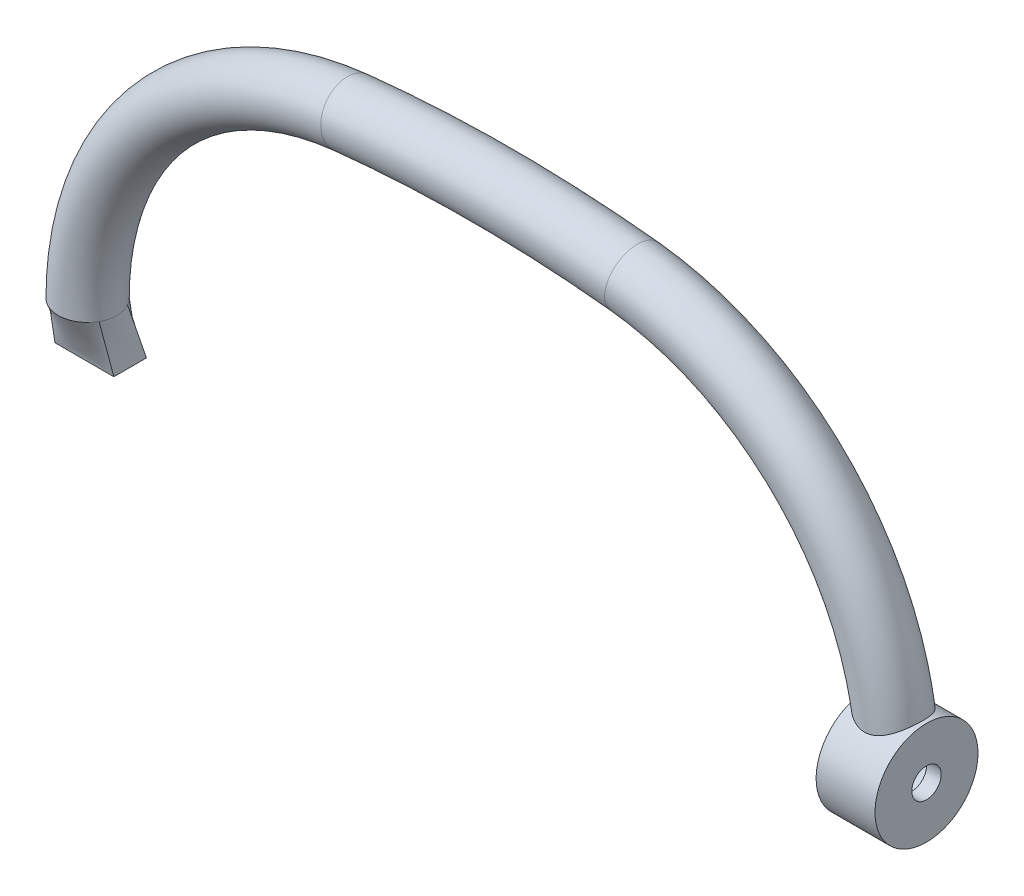
ISO-10303-21;
HEADER;
FILE_DESCRIPTION(('STEP AP214'),'2;1');
FILE_NAME('part.step','',(''),(''),'','','');
FILE_SCHEMA(('AUTOMOTIVE_DESIGN { 1 0 10303 214 1 1 1 1 }'));
ENDSEC;
DATA;
#1=APPLICATION_CONTEXT('core data for automotive mechanical design processes');
#2=APPLICATION_PROTOCOL_DEFINITION('international standard','automotive_design',2000,#1);
#3=PRODUCT_CONTEXT('',#1,'mechanical');
#4=PRODUCT('Part','Part','',(#3));
#5=PRODUCT_RELATED_PRODUCT_CATEGORY('part','',(#4));
#6=PRODUCT_DEFINITION_FORMATION('','',#4);
#7=PRODUCT_DEFINITION_CONTEXT('part definition',#1,'design');
#8=PRODUCT_DEFINITION('design','',#6,#7);
#9=PRODUCT_DEFINITION_SHAPE('','',#8);
#10=(LENGTH_UNIT() NAMED_UNIT(*) SI_UNIT(.MILLI.,.METRE.));
#11=(NAMED_UNIT(*) PLANE_ANGLE_UNIT() SI_UNIT($,.RADIAN.));
#12=(NAMED_UNIT(*) SI_UNIT($,.STERADIAN.) SOLID_ANGLE_UNIT());
#13=UNCERTAINTY_MEASURE_WITH_UNIT(LENGTH_MEASURE(1.E-05),#10,'distance_accuracy_value','');
#14=(GEOMETRIC_REPRESENTATION_CONTEXT(3) GLOBAL_UNCERTAINTY_ASSIGNED_CONTEXT((#13)) GLOBAL_UNIT_ASSIGNED_CONTEXT((#10,
#11,#12)) REPRESENTATION_CONTEXT('',''));
#15=CARTESIAN_POINT('',(0.,0.,0.));
#16=DIRECTION('',(0.,0.,1.));
#17=DIRECTION('',(1.,0.,0.));
#18=AXIS2_PLACEMENT_3D('',#15,#16,#17);
#19=CARTESIAN_POINT('',(0.,0.,0.));
#20=DIRECTION('',(0.,0.,-1.));
#21=DIRECTION('',(-1.,0.,0.));
#22=AXIS2_PLACEMENT_3D('',#19,#20,#21);
#23=TOROIDAL_SURFACE('',#22,20.,2.);
#24=CARTESIAN_POINT('',(2.14285714285713,19.8848727243929,0.));
#25=DIRECTION('',(0.994243636219647,-0.107142857142856,0.));
#26=DIRECTION('',(0.,0.,1.));
#27=AXIS2_PLACEMENT_3D('',#24,#25,#26);
#28=CIRCLE('',#27,2.);
#29=CARTESIAN_POINT('',(2.35714285714285,21.8733599968322,0.));
#30=VERTEX_POINT('',#29);
#31=EDGE_CURVE('E368',#30,#30,#28,.T.);
#32=ORIENTED_EDGE('',*,*,#31,.T.);
#33=EDGE_LOOP('',(#32));
#34=FACE_BOUND('',#33,.T.);
#35=CARTESIAN_POINT('',(18.,0.,0.));
#36=CARTESIAN_POINT('',(18.,0.0084852776977507,-0.0028284187399953));
#37=CARTESIAN_POINT('',(18.,0.0169705591225947,-0.00565684601700149));
#38=CARTESIAN_POINT('',(17.9999999999998,0.658301578533719,-0.219432779855528));
#39=CARTESIAN_POINT('',(18.,1.29120259657415,-0.430319034278899));
#40=CARTESIAN_POINT('',(18.,2.24425640629901,-0.734311765184615));
#41=CARTESIAN_POINT('',(18.,2.56243364505894,-0.833550381746703));
#42=CARTESIAN_POINT('',(18.,3.20074197947092,-1.02574997816264));
#43=CARTESIAN_POINT('',(18.,3.52087333604269,-1.11871009877498));
#44=CARTESIAN_POINT('',(18.,4.1773883543311,-1.29971375438033));
#45=CARTESIAN_POINT('',(18.,4.51387873008351,-1.38737375011006));
#46=CARTESIAN_POINT('',(18.,5.18983128002098,-1.54998941439078));
#47=CARTESIAN_POINT('',(18.,5.52929214699563,-1.62495040212449));
#48=CARTESIAN_POINT('',(18.,6.04168741426811,-1.72514605558347));
#49=CARTESIAN_POINT('',(18.,6.21341730964267,-1.75656150006879));
#50=CARTESIAN_POINT('',(18.,6.55767044922207,-1.814633233064));
#51=CARTESIAN_POINT('',(18.,6.73019362052485,-1.84128995027581));
#52=CARTESIAN_POINT('',(18.,7.07625478611551,-1.88923870648288));
#53=CARTESIAN_POINT('',(18.,7.24979390459324,-1.91052274578261));
#54=CARTESIAN_POINT('',(18.,7.59757211624587,-1.94689640907685));
#55=CARTESIAN_POINT('',(18.,7.77181141715341,-1.96198403273679));
#56=CARTESIAN_POINT('',(18.,7.94631419912595,-1.9735770658888));
#57=B_SPLINE_CURVE_WITH_KNOTS('',3,(#35,#36,#37,#38,#39,#40,#41,#42,#43,#44,#45,#46,#47,#48,#49,
#50,#51,#52,#53,#54,#55,#56),.UNSPECIFIED.,.F.,.F.,(4,2,2,2,2,2,2,2,2,2,4),(0.,
0.026832815730005,2.02806436761708,3.02790306012793,4.02787830912823,5.07087129770871,
6.11342632596965,6.63711099490324,7.16074846255347,7.68516106592174,8.20974282799929),.UNSPECIFIED.);
#58=CARTESIAN_POINT('',(18.,3.33448482715097,-1.06358400585001));
#59=VERTEX_POINT('',#58);
#60=CARTESIAN_POINT('',(18.,2.37684960872581,-0.774974797977307));
#61=VERTEX_POINT('',#60);
#62=EDGE_CURVE('E354',#59,#61,#57,.F.);
#63=ORIENTED_EDGE('',*,*,#62,.T.);
#64=CARTESIAN_POINT('',(21.0002,1.84920408115571,-1.68239242337722));
#65=CARTESIAN_POINT('',(20.9659400207683,1.8281763171251,-1.70550837746359));
#66=CARTESIAN_POINT('',(20.9308341573535,1.80735001728865,-1.72752423418774));
#67=CARTESIAN_POINT('',(20.8588126614154,1.76645354930086,-1.76932121222239));
#68=CARTESIAN_POINT('',(20.8218944917588,1.74638451500908,-1.78909906466791));
#69=CARTESIAN_POINT('',(20.7074262525141,1.68743632729869,-1.84540512722082));
#70=CARTESIAN_POINT('',(20.627037805483,1.65037595329724,-1.87830830087958));
#71=CARTESIAN_POINT('',(20.4752478050657,1.59193461069129,-1.92793427620761));
#72=CARTESIAN_POINT('',(20.4051128714825,1.5689075648736,-1.94655533298262));
#73=CARTESIAN_POINT('',(20.261212563212,1.53193814485359,-1.9757852676492));
#74=CARTESIAN_POINT('',(20.1874708568212,1.51794335391162,-1.98644043209632));
#75=CARTESIAN_POINT('',(20.0373143172989,1.50102796040123,-1.99926056599483));
#76=CARTESIAN_POINT('',(19.9608823022502,1.49820082474848,-2.00135388278599));
#77=CARTESIAN_POINT('',(19.8086353754033,1.50409220955324,-1.99692530932764));
#78=CARTESIAN_POINT('',(19.732822006416,1.5128338686445,-1.9903861534186));
#79=CARTESIAN_POINT('',(19.5674729007258,1.54288109253603,-1.96721604749341));
#80=CARTESIAN_POINT('',(19.4786653313316,1.56656148139488,-1.94865336428687));
#81=CARTESIAN_POINT('',(19.3066828303237,1.62317614426913,-1.90174580669176));
#82=CARTESIAN_POINT('',(19.2235274982601,1.65614076365622,-1.87336878374694));
#83=CARTESIAN_POINT('',(19.0807544410261,1.7193347903655,-1.81529927789146));
#84=CARTESIAN_POINT('',(19.019988848792,1.74856533489378,-1.78727564837799));
#85=CARTESIAN_POINT('',(18.9018279187219,1.80876343224496,-1.72632820661112));
#86=CARTESIAN_POINT('',(18.8444344793306,1.83973194468301,-1.69340167030718));
#87=CARTESIAN_POINT('',(18.7330116274173,1.90229977579267,-1.62280076667258));
#88=CARTESIAN_POINT('',(18.6789822814753,1.93389910693271,-1.58512630541854));
#89=CARTESIAN_POINT('',(18.5743816517581,1.99684721331987,-1.50505708214785));
#90=CARTESIAN_POINT('',(18.5238110609927,2.02819593724961,-1.4626613786107));
#91=CARTESIAN_POINT('',(18.3931590777696,2.11086836372509,-1.34260447029889));
#92=CARTESIAN_POINT('',(18.3164118033667,2.16126923196937,-1.26057655044263));
#93=CARTESIAN_POINT('',(18.1757256556394,2.25547600727885,-1.08300225219527));
#94=CARTESIAN_POINT('',(18.111757922838,2.29929671709744,-0.987487183956426));
#95=CARTESIAN_POINT('',(18.0137271602174,2.36718458732854,-0.808244709684123));
#96=CARTESIAN_POINT('',(17.976174083208,2.3934648639459,-0.727279992327964));
#97=CARTESIAN_POINT('',(17.9124656454321,2.43827195385319,-0.558923472064251));
#98=CARTESIAN_POINT('',(17.8863020860854,2.45680434396562,-0.471536345375159));
#99=CARTESIAN_POINT('',(17.8471376264748,2.48460522315396,-0.291662019522292));
#100=CARTESIAN_POINT('',(17.8342363123815,2.493803616737,-0.199141654786769));
#101=CARTESIAN_POINT('',(17.8231535456483,2.5017030057623,-0.0127866316599169));
#102=CARTESIAN_POINT('',(17.8249647506525,2.50040923737083,0.081047347827014));
#103=CARTESIAN_POINT('',(17.8420562037888,2.48823414733131,0.255915691565243));
#104=CARTESIAN_POINT('',(17.8557772137586,2.47846278346837,0.337189603861867));
#105=CARTESIAN_POINT('',(17.8936149233576,2.451627898906,0.496000573165247));
#106=CARTESIAN_POINT('',(17.9177357483659,2.43456148444278,0.573536133665217));
#107=CARTESIAN_POINT('',(17.9836735803289,2.38819587142494,0.746144905391312));
#108=CARTESIAN_POINT('',(18.0286353085314,2.35675865732979,0.839439275629168));
#109=CARTESIAN_POINT('',(18.1307982085419,2.28627415601607,1.01588993646429));
#110=CARTESIAN_POINT('',(18.1880231443961,2.24721210643044,1.09902604376982));
#111=CARTESIAN_POINT('',(18.3329346806832,2.15024733469275,1.28072103732762));
#112=CARTESIAN_POINT('',(18.4244240801286,2.09039782497562,1.37522135090106));
#113=CARTESIAN_POINT('',(18.5720088789794,1.99836189272847,1.50310557204634));
#114=CARTESIAN_POINT('',(18.6230007561376,1.96726510290094,1.54346528484859));
#115=CARTESIAN_POINT('',(18.728314834291,1.90508621486735,1.61958629148961));
#116=CARTESIAN_POINT('',(18.7826361048173,1.87400411498086,1.65534886152085));
#117=CARTESIAN_POINT('',(18.9289950401211,1.79385072533904,1.74282768972392));
#118=CARTESIAN_POINT('',(19.0236766969994,1.74547623429723,1.79082345777283));
#119=CARTESIAN_POINT('',(19.2218092475537,1.65618874008624,1.87369227111685));
#120=CARTESIAN_POINT('',(19.3252322654951,1.61525323871825,1.90860523560807));
#121=CARTESIAN_POINT('',(19.5026194115017,1.56051593557565,1.95335042977941));
#122=CARTESIAN_POINT('',(19.5740239831555,1.54223985103943,1.96768629973102));
#123=CARTESIAN_POINT('',(19.7195865072396,1.51477420821138,1.98891135508101));
#124=CARTESIAN_POINT('',(19.7937376266186,1.50556348997703,1.99581788520987));
#125=CARTESIAN_POINT('',(19.9435301776995,1.49815275346038,2.00139225379784));
#126=CARTESIAN_POINT('',(20.0191786499759,1.50003686175042,1.99999714419726));
#127=CARTESIAN_POINT('',(20.1687551559612,1.51501303309903,1.98867106720634));
#128=CARTESIAN_POINT('',(20.2426806438174,1.52812071962581,1.97872820107328));
#129=CARTESIAN_POINT('',(20.3998745599466,1.56667278936235,1.94839099788901));
#130=CARTESIAN_POINT('',(20.4823719968076,1.59393797425332,1.92641507589139));
#131=CARTESIAN_POINT('',(20.6408953211212,1.65665420044318,1.87274936566448));
#132=CARTESIAN_POINT('',(20.7169046832208,1.69212533813717,1.84103566615615));
#133=CARTESIAN_POINT('',(20.8264673866117,1.74884794130322,1.78668353737853));
#134=CARTESIAN_POINT('',(20.8625119126297,1.76851044910297,1.7672554836304));
#135=CARTESIAN_POINT('',(20.9327004918064,1.80845658773598,1.7263539443983));
#136=CARTESIAN_POINT('',(20.96685479849,1.82873569698201,1.70489366186803));
#137=CARTESIAN_POINT('',(21.0002,1.84920408115571,1.68239242337722));
#138=B_SPLINE_CURVE_WITH_KNOTS('',3,(#64,#65,#66,#67,#68,#69,#70,#71,#72,#73,#74,#75,#76,#77,
#78,#79,#80,#81,#82,#83,#84,#85,#86,#87,#88,#89,#90,#91,#92,#93,#94,#95,#96,#97,#98,#99,#100,
#101,#102,#103,#104,#105,#106,#107,#108,#109,#110,#111,#112,#113,#114,#115,#116,#117,#118,#119,
#120,#121,#122,#123,#124,#125,#126,#127,#128,#129,#130,#131,#132,#133,#134,#135,#136,#137),
.UNSPECIFIED.,.F.,.F.,(4,2,2,2,2,2,2,2,2,2,2,2,2,2,2,2,2,2,2,2,2,2,2,2,2,2,2,2,2,2,2,2,2,2,2,2,
4),(0.,0.139055779930908,0.278312114450483,0.560394207510414,0.787948799447709,1.01417066227201,
1.24228191159127,1.4708500942327,1.75059457452604,2.03126422357064,2.25006455318216,
2.4689869048072,2.68791358783111,2.90688400814315,3.27485253041132,3.64198045150225,
3.92003401231304,4.19788708796581,4.47781164961812,4.75759652210796,5.00548130727855,
5.25346451351639,5.57636960624353,5.89990618664631,6.33098158319245,6.5470724113636,
6.76310312136872,7.11203670972705,7.45989676548058,7.68439654294631,7.90837105219846,
8.13404602506935,8.36003565413198,8.62744584850291,8.89551799659354,9.03171483794834,
9.16708070539416),.UNSPECIFIED.);
#139=CARTESIAN_POINT('',(18.,2.37684960872581,0.7749747979773));
#140=VERTEX_POINT('',#139);
#141=EDGE_CURVE('E87',#61,#140,#138,.T.);
#142=ORIENTED_EDGE('',*,*,#141,.T.);
#143=CARTESIAN_POINT('',(18.,0.,0.));
#144=CARTESIAN_POINT('',(18.,0.0084852776977507,0.0028284187399953));
#145=CARTESIAN_POINT('',(18.,0.0169705591225947,0.00565684601700149));
#146=CARTESIAN_POINT('',(17.9999999999998,0.658301578533719,0.219432779855528));
#147=CARTESIAN_POINT('',(18.,1.29120259657415,0.430319034278899));
#148=CARTESIAN_POINT('',(18.,2.24425640629901,0.734311765184615));
#149=CARTESIAN_POINT('',(18.,2.56243364505894,0.833550381746703));
#150=CARTESIAN_POINT('',(18.,3.20074197947092,1.02574997816264));
#151=CARTESIAN_POINT('',(18.,3.52087333604269,1.11871009877498));
#152=CARTESIAN_POINT('',(18.,4.1773883543311,1.29971375438033));
#153=CARTESIAN_POINT('',(18.,4.51387873008351,1.38737375011006));
#154=CARTESIAN_POINT('',(18.,5.18983128002098,1.54998941439078));
#155=CARTESIAN_POINT('',(18.,5.52929214699563,1.62495040212449));
#156=CARTESIAN_POINT('',(18.,6.04168741426811,1.72514605558347));
#157=CARTESIAN_POINT('',(18.,6.21341730964267,1.75656150006879));
#158=CARTESIAN_POINT('',(18.,6.55767044922207,1.814633233064));
#159=CARTESIAN_POINT('',(18.,6.73019362052485,1.84128995027581));
#160=CARTESIAN_POINT('',(18.,7.07625478611551,1.88923870648288));
#161=CARTESIAN_POINT('',(18.,7.24979390459324,1.91052274578261));
#162=CARTESIAN_POINT('',(18.,7.59757211624587,1.94689640907685));
#163=CARTESIAN_POINT('',(18.,7.77181141715341,1.96198403273679));
#164=CARTESIAN_POINT('',(18.,7.94631419912595,1.9735770658888));
#165=B_SPLINE_CURVE_WITH_KNOTS('',3,(#143,#144,#145,#146,#147,#148,#149,#150,#151,#152,#153,
#154,#155,#156,#157,#158,#159,#160,#161,#162,#163,#164),.UNSPECIFIED.,.F.,.F.,(4,2,2,2,2,2,2,2,
2,2,4),(0.,0.026832815730005,2.02806436761708,3.02790306012793,4.02787830912823,
5.07087129770871,6.11342632596965,6.63711099490324,7.16074846255347,7.68516106592174,
8.20974282799929),.UNSPECIFIED.);
#166=CARTESIAN_POINT('',(18.,3.33448482715097,1.06358400585003));
#167=VERTEX_POINT('',#166);
#168=EDGE_CURVE('E360',#140,#167,#165,.T.);
#169=ORIENTED_EDGE('',*,*,#168,.T.);
#170=CARTESIAN_POINT('',(17.9998,3.33457626116305,1.06329730484369));
#171=CARTESIAN_POINT('',(18.0363091323096,3.31789105265571,1.11562869203751));
#172=CARTESIAN_POINT('',(18.0751241034328,3.30044875989444,1.16606765998625));
#173=CARTESIAN_POINT('',(18.1569237271834,3.26457839392446,1.26301004206407));
#174=CARTESIAN_POINT('',(18.199905639204,3.24615097216754,1.30951600575166));
#175=CARTESIAN_POINT('',(18.2898456686957,3.20873248983682,1.3987084198935));
#176=CARTESIAN_POINT('',(18.3368206338454,3.18973928545513,1.44137694702646));
#177=CARTESIAN_POINT('',(18.434252147841,3.15180209485896,1.52254830916065));
#178=CARTESIAN_POINT('',(18.4847093696856,3.13285811889683,1.56105033520925));
#179=CARTESIAN_POINT('',(18.6406944885313,3.07698303903905,1.66997303348215));
#180=CARTESIAN_POINT('',(18.751079363279,3.04090298447734,1.73405013932892));
#181=CARTESIAN_POINT('',(18.9826183110037,2.97596252469405,1.84328537038773));
#182=CARTESIAN_POINT('',(19.103747481911,2.94708598742258,1.88848592501745));
#183=CARTESIAN_POINT('',(19.3233218363191,2.90739492572545,1.94885105682099));
#184=CARTESIAN_POINT('',(19.4199871339562,2.89388154388067,1.96867539636436));
#185=CARTESIAN_POINT('',(19.6159332370732,2.87600219201849,1.99471224939088));
#186=CARTESIAN_POINT('',(19.7152103780191,2.87162403254136,2.00094290193288));
#187=CARTESIAN_POINT('',(19.9140067994462,2.87310281756684,1.99882127331833));
#188=CARTESIAN_POINT('',(20.0135252500963,2.87900444300078,1.99040533109534));
#189=CARTESIAN_POINT('',(20.2091066871176,2.90063048921015,1.95874901348618));
#190=CARTESIAN_POINT('',(20.3051678599081,2.9163599881875,1.93550097401342));
#191=CARTESIAN_POINT('',(20.4854793441265,2.95444918234663,1.87679578154595));
#192=CARTESIAN_POINT('',(20.5700922401961,2.97636042033662,1.84214433455738));
#193=CARTESIAN_POINT('',(20.7322592152115,3.02479612088587,1.76148164087721));
#194=CARTESIAN_POINT('',(20.8098112220167,3.05132193106636,1.71546707409409));
#195=CARTESIAN_POINT('',(20.9652396586268,3.1097795390293,1.60731341669279));
#196=CARTESIAN_POINT('',(21.0421514799027,3.1419831188564,1.54393618088415));
#197=CARTESIAN_POINT('',(21.1850606661402,3.20618831290656,1.40576202071665));
#198=CARTESIAN_POINT('',(21.2510515506504,3.23818979645127,1.3309583662174));
#199=CARTESIAN_POINT('',(21.3778002493681,3.30265874441415,1.16251013603568));
#200=CARTESIAN_POINT('',(21.4371885958895,3.33479179926378,1.06769875032711));
#201=CARTESIAN_POINT('',(21.5400127905396,3.39227934344075,0.867892591890911));
#202=CARTESIAN_POINT('',(21.5834512258483,3.41763493193589,0.762899474202652));
#203=CARTESIAN_POINT('',(21.6522811327339,3.45853031634701,0.547961994301504));
#204=CARTESIAN_POINT('',(21.6780508145339,3.47427497443037,0.438178684237475));
#205=CARTESIAN_POINT('',(21.7120999758929,3.49518703188856,0.214967059701215));
#206=CARTESIAN_POINT('',(21.720388096301,3.50035965680684,0.101540574151955));
#207=CARTESIAN_POINT('',(21.7192038392296,3.49962702906512,-0.117236466160859));
#208=CARTESIAN_POINT('',(21.7109295535973,3.49446905580281,-0.222598667696498));
#209=CARTESIAN_POINT('',(21.6792817730102,3.47503013320063,-0.430150177485363));
#210=CARTESIAN_POINT('',(21.6559084228071,3.46074927132018,-0.532339516146377));
#211=CARTESIAN_POINT('',(21.594916799711,3.42439704121191,-0.730498676832909));
#212=CARTESIAN_POINT('',(21.5573453506957,3.40235129683892,-0.826487741298431));
#213=CARTESIAN_POINT('',(21.4689297451087,3.35232238379997,-1.01046176112697));
#214=CARTESIAN_POINT('',(21.4180818383103,3.3243375379232,-1.09844444542748));
#215=CARTESIAN_POINT('',(21.3003181599651,3.26273035016129,-1.27021991860113));
#216=CARTESIAN_POINT('',(21.2325583449327,3.22885678998095,-1.35334432713307));
#217=CARTESIAN_POINT('',(21.0841633466097,3.16014618812446,-1.50683765682664));
#218=CARTESIAN_POINT('',(21.0035184420866,3.12530843554644,-1.57719686092736));
#219=CARTESIAN_POINT('',(20.8269728186664,3.05697609157165,-1.70599771959884));
#220=CARTESIAN_POINT('',(20.7305840508694,3.02359422420185,-1.76383630763051));
#221=CARTESIAN_POINT('',(20.5270608918365,2.96437832856321,-1.86165464270734));
#222=CARTESIAN_POINT('',(20.419942933499,2.93853298778732,-1.90166120426452));
#223=CARTESIAN_POINT('',(20.2093818495358,2.90061137664081,-1.95896087815292));
#224=CARTESIAN_POINT('',(20.1066580722581,2.88740912841248,-1.97813814481935));
#225=CARTESIAN_POINT('',(19.8987017866352,2.87233106760249,-1.99997608883406));
#226=CARTESIAN_POINT('',(19.7934709573264,2.87044787718661,-2.00264752481999));
#227=CARTESIAN_POINT('',(19.5955422256662,2.87737406456528,-1.99266837979597));
#228=CARTESIAN_POINT('',(19.5027106124981,2.88505830399463,-1.98163038820107));
#229=CARTESIAN_POINT('',(19.3201176741506,2.90791434132242,-1.94793293697069));
#230=CARTESIAN_POINT('',(19.2303593633948,2.92309327738631,-1.92526239735209));
#231=CARTESIAN_POINT('',(19.0237176636082,2.9656249770246,-1.8593297138039));
#232=CARTESIAN_POINT('',(18.9087614771746,2.99539506006333,-1.81158599743635));
#233=CARTESIAN_POINT('',(18.6893138050071,3.0606824153974,-1.69895891822196));
#234=CARTESIAN_POINT('',(18.5848394673149,3.09620886448915,-1.63404808132893));
#235=CARTESIAN_POINT('',(18.3928115395615,3.16704390555781,-1.49192063022727));
#236=CARTESIAN_POINT('',(18.3046857961447,3.20228079223515,-1.41544604359217));
#237=CARTESIAN_POINT('',(18.1824461002203,3.25361689337348,-1.29073429798671));
#238=CARTESIAN_POINT('',(18.1433998893628,3.27045581612254,-1.24755667125209));
#239=CARTESIAN_POINT('',(18.0688546984822,3.3032665821276,-1.15789003031653));
#240=CARTESIAN_POINT('',(18.0333578814679,3.31923789398471,-1.11139902613461));
#241=CARTESIAN_POINT('',(17.9998000000005,3.33457626116282,-1.06329730484442));
#242=B_SPLINE_CURVE_WITH_KNOTS('',3,(#170,#171,#172,#173,#174,#175,#176,#177,#178,#179,#180,
#181,#182,#183,#184,#185,#186,#187,#188,#189,#190,#191,#192,#193,#194,#195,#196,#197,#198,#199,
#200,#201,#202,#203,#204,#205,#206,#207,#208,#209,#210,#211,#212,#213,#214,#215,#216,#217,#218,
#219,#220,#221,#222,#223,#224,#225,#226,#227,#228,#229,#230,#231,#232,#233,#234,#235,#236,#237,
#238,#239,#240,#241),.UNSPECIFIED.,.F.,.F.,(4,2,2,2,2,2,2,2,2,2,2,2,2,2,2,2,2,2,2,2,2,2,2,2,2,2,
2,2,2,2,2,2,2,2,2,4),(0.,0.197739816003404,0.395350449167282,0.593840708854948,
0.792369437803265,1.18836606198348,1.58346773800909,1.88105526356294,2.17824545265113,
2.47673059979591,2.77537010615267,3.05630120615917,3.33731448630996,3.65026155519927,
3.96339366520725,4.3108963736186,4.65834268988591,4.99809777124924,5.33768487785345,
5.65359356877597,5.96949923118706,6.28437203453715,6.5993338770254,6.93525397516744,
7.27142871746496,7.62131382570142,7.97067101223068,8.28478601620633,8.59869625579317,
8.87893895278317,9.15944907736664,9.54138663334032,9.9239391756028,10.2880921506594,
10.4697195869696,10.6514570413859),.UNSPECIFIED.);
#243=EDGE_CURVE('E73',#167,#59,#242,.T.);
#244=ORIENTED_EDGE('',*,*,#243,.T.);
#245=EDGE_LOOP('',(#63,#142,#169,#244));
#246=FACE_BOUND('',#245,.T.);
#247=ADVANCED_FACE('F63',(#34,#246),#23,.T.);
#248=CARTESIAN_POINT('',(18.,0.,0.));
#249=DIRECTION('',(1.,0.,0.));
#250=DIRECTION('',(0.,0.,-1.));
#251=AXIS2_PLACEMENT_3D('',#248,#249,#250);
#252=PLANE('',#251);
#253=CARTESIAN_POINT('',(18.,0.,0.));
#254=DIRECTION('',(1.,0.,0.));
#255=DIRECTION('',(0.,0.,-1.));
#256=AXIS2_PLACEMENT_3D('',#253,#254,#255);
#257=CIRCLE('',#256,2.5);
#258=EDGE_CURVE('E12',#61,#140,#257,.F.);
#259=ORIENTED_EDGE('',*,*,#258,.F.);
#260=ORIENTED_EDGE('',*,*,#62,.F.);
#261=CARTESIAN_POINT('',(18.,0.,0.));
#262=DIRECTION('',(1.,0.,0.));
#263=DIRECTION('',(0.,0.,-1.));
#264=AXIS2_PLACEMENT_3D('',#261,#262,#263);
#265=CIRCLE('',#264,3.5);
#266=EDGE_CURVE('E397',#167,#59,#265,.T.);
#267=ORIENTED_EDGE('',*,*,#266,.F.);
#268=ORIENTED_EDGE('',*,*,#168,.F.);
#269=EDGE_LOOP('',(#259,#260,#267,#268));
#270=FACE_BOUND('',#269,.T.);
#271=ADVANCED_FACE('F340',(#270),#252,.F.);
#272=CARTESIAN_POINT('',(18.,0.,0.));
#273=DIRECTION('',(1.,0.,0.));
#274=DIRECTION('',(0.,0.,-1.));
#275=AXIS2_PLACEMENT_3D('',#272,#273,#274);
#276=CYLINDRICAL_SURFACE('',#275,1.);
#277=CARTESIAN_POINT('',(22.,0.,0.));
#278=DIRECTION('',(1.,0.,0.));
#279=DIRECTION('',(0.,0.,-1.));
#280=AXIS2_PLACEMENT_3D('',#277,#278,#279);
#281=CIRCLE('',#280,1.);
#282=CARTESIAN_POINT('',(22.,0.,-1.));
#283=VERTEX_POINT('',#282);
#284=EDGE_CURVE('E329',#283,#283,#281,.T.);
#285=ORIENTED_EDGE('',*,*,#284,.T.);
#286=EDGE_LOOP('',(#285));
#287=FACE_BOUND('',#286,.T.);
#288=CARTESIAN_POINT('',(21.,0.,0.));
#289=DIRECTION('',(-1.,0.,0.));
#290=DIRECTION('',(0.,0.,1.));
#291=AXIS2_PLACEMENT_3D('',#288,#289,#290);
#292=CIRCLE('',#291,1.);
#293=CARTESIAN_POINT('',(21.,0.,1.));
#294=VERTEX_POINT('',#293);
#295=EDGE_CURVE('E323',#294,#294,#292,.F.);
#296=ORIENTED_EDGE('',*,*,#295,.F.);
#297=EDGE_LOOP('',(#296));
#298=FACE_BOUND('',#297,.T.);
#299=ADVANCED_FACE('F336',(#287,#298),#276,.F.);
#300=CARTESIAN_POINT('',(-7.49999999999999,-69.5970545353752,0.));
#301=DIRECTION('',(0.,0.,-1.));
#302=DIRECTION('',(-1.,0.,0.));
#303=AXIS2_PLACEMENT_3D('',#300,#301,#302);
#304=TOROIDAL_SURFACE('',#303,90.,2.);
#305=CARTESIAN_POINT('',(-17.1428571428572,19.8848727243929,0.));
#306=DIRECTION('',(0.994243636219647,0.107142857142858,0.));
#307=DIRECTION('',(0.,0.,1.));
#308=AXIS2_PLACEMENT_3D('',#305,#306,#307);
#309=CIRCLE('',#308,2.);
#310=CARTESIAN_POINT('',(-17.3571428571429,21.8733599968322,0.));
#311=VERTEX_POINT('',#310);
#312=EDGE_CURVE('E365',#311,#311,#309,.T.);
#313=CARTESIAN_POINT('',(-7.49999999999999,-69.5970545353752,0.));
#314=DIRECTION('',(0.,0.,-1.));
#315=DIRECTION('',(-1.,0.,0.));
#316=AXIS2_PLACEMENT_3D('',#313,#314,#315);
#317=CIRCLE('',#316,92.);
#318=EDGE_CURVE('',#311,#30,#317,.T.);
#319=ORIENTED_EDGE('',*,*,#312,.T.);
#320=ORIENTED_EDGE('',*,*,#31,.F.);
#321=ORIENTED_EDGE('',*,*,#318,.T.);
#322=ORIENTED_EDGE('',*,*,#318,.F.);
#323=EDGE_LOOP('',(#319,#321,#320,#322));
#324=FACE_BOUND('',#323,.T.);
#325=ADVANCED_FACE('F339',(#324),#304,.T.);
#326=CARTESIAN_POINT('',(-15.,0.,0.));
#327=DIRECTION('',(0.,0.,1.));
#328=DIRECTION('',(1.,0.,0.));
#329=AXIS2_PLACEMENT_3D('',#326,#327,#328);
#330=TOROIDAL_SURFACE('',#329,20.,2.);
#331=ORIENTED_EDGE('',*,*,#312,.F.);
#332=EDGE_LOOP('',(#331));
#333=FACE_BOUND('',#332,.T.);
#334=CARTESIAN_POINT('',(-33.2505306453836,0.,-0.969204301093542));
#335=CARTESIAN_POINT('',(-33.1722508972788,0.,-0.827904865833083));
#336=CARTESIAN_POINT('',(-33.1088131786324,0.,-0.672414540816247));
#337=CARTESIAN_POINT('',(-33.0226264545855,0.,-0.34456170697065));
#338=CARTESIAN_POINT('',(-33.,0.,-0.172327372120939));
#339=CARTESIAN_POINT('',(-33.,0.,0.172327372120938));
#340=CARTESIAN_POINT('',(-33.0226264545855,0.,0.34456170697065));
#341=CARTESIAN_POINT('',(-33.1088131786324,0.,0.672414540816247));
#342=CARTESIAN_POINT('',(-33.1722508972788,0.,0.827904865833083));
#343=CARTESIAN_POINT('',(-33.2505306453836,0.,0.969204301093542));
#344=B_SPLINE_CURVE_WITH_KNOTS('',3,(#334,#335,#336,#337,#338,#339,#340,#341,#342,#343),
.UNSPECIFIED.,.F.,.F.,(4,2,2,2,4),(0.,0.25,0.5,0.75,1.),.UNSPECIFIED.);
#345=CARTESIAN_POINT('',(-33.250411660328,0.,0.969269822479166));
#346=VERTEX_POINT('',#345);
#347=CARTESIAN_POINT('',(-33.2504286144142,0.,-0.969260452406175));
#348=VERTEX_POINT('',#347);
#349=EDGE_CURVE('E148',#346,#348,#344,.F.);
#350=ORIENTED_EDGE('',*,*,#349,.T.);
#351=CARTESIAN_POINT('',(-35.,0.,0.));
#352=DIRECTION('',(0.,-1.,0.));
#353=DIRECTION('',(0.,0.,-1.));
#354=AXIS2_PLACEMENT_3D('',#351,#352,#353);
#355=CIRCLE('',#354,2.);
#356=CARTESIAN_POINT('',(-36.7495883396719,0.,-0.969269822479122));
#357=VERTEX_POINT('',#356);
#358=EDGE_CURVE('E67',#357,#348,#355,.T.);
#359=ORIENTED_EDGE('',*,*,#358,.F.);
#360=CARTESIAN_POINT('',(-36.749571385586,0.,0.96926045240629));
#361=VERTEX_POINT('',#360);
#362=EDGE_CURVE('E119',#361,#357,#355,.T.);
#363=ORIENTED_EDGE('',*,*,#362,.F.);
#364=EDGE_CURVE('E132',#346,#361,#355,.T.);
#365=ORIENTED_EDGE('',*,*,#364,.F.);
#366=EDGE_LOOP('',(#350,#359,#363,#365));
#367=FACE_BOUND('',#366,.T.);
#368=ADVANCED_FACE('F147',(#333,#367),#330,.T.);
#369=CARTESIAN_POINT('',(22.,0.,0.));
#370=DIRECTION('',(-1.,0.,0.));
#371=DIRECTION('',(0.,0.,1.));
#372=AXIS2_PLACEMENT_3D('',#369,#370,#371);
#373=CYLINDRICAL_SURFACE('',#372,3.5);
#374=ORIENTED_EDGE('',*,*,#243,.F.);
#375=ORIENTED_EDGE('',*,*,#266,.T.);
#376=EDGE_LOOP('',(#374,#375));
#377=FACE_BOUND('',#376,.T.);
#378=CARTESIAN_POINT('',(22.,0.,0.));
#379=DIRECTION('',(1.,0.,0.));
#380=DIRECTION('',(0.,0.,-1.));
#381=AXIS2_PLACEMENT_3D('',#378,#379,#380);
#382=CIRCLE('',#381,3.5);
#383=CARTESIAN_POINT('',(22.,0.,-3.5));
#384=VERTEX_POINT('',#383);
#385=EDGE_CURVE('E395',#384,#384,#382,.T.);
#386=ORIENTED_EDGE('',*,*,#385,.F.);
#387=EDGE_LOOP('',(#386));
#388=FACE_BOUND('',#387,.T.);
#389=ADVANCED_FACE('F345',(#377,#388),#373,.T.);
#390=CARTESIAN_POINT('',(22.,0.,0.));
#391=DIRECTION('',(1.,0.,0.));
#392=DIRECTION('',(0.,0.,-1.));
#393=AXIS2_PLACEMENT_3D('',#390,#391,#392);
#394=PLANE('',#393);
#395=ORIENTED_EDGE('',*,*,#284,.F.);
#396=EDGE_LOOP('',(#395));
#397=FACE_BOUND('',#396,.T.);
#398=ORIENTED_EDGE('',*,*,#385,.T.);
#399=EDGE_LOOP('',(#398));
#400=FACE_BOUND('',#399,.T.);
#401=ADVANCED_FACE('F342',(#397,#400),#394,.T.);
#402=CARTESIAN_POINT('',(21.,0.,0.));
#403=DIRECTION('',(-1.,0.,0.));
#404=DIRECTION('',(0.,0.,1.));
#405=AXIS2_PLACEMENT_3D('',#402,#403,#404);
#406=PLANE('',#405);
#407=CARTESIAN_POINT('',(21.,0.,0.));
#408=DIRECTION('',(-1.,0.,0.));
#409=DIRECTION('',(0.,0.,1.));
#410=AXIS2_PLACEMENT_3D('',#407,#408,#409);
#411=CIRCLE('',#410,2.5);
#412=CARTESIAN_POINT('',(21.,0.,2.5));
#413=VERTEX_POINT('',#412);
#414=EDGE_CURVE('E150',#413,#413,#411,.T.);
#415=ORIENTED_EDGE('',*,*,#414,.T.);
#416=EDGE_LOOP('',(#415));
#417=FACE_BOUND('',#416,.T.);
#418=ORIENTED_EDGE('',*,*,#295,.T.);
#419=EDGE_LOOP('',(#418));
#420=FACE_BOUND('',#419,.T.);
#421=ADVANCED_FACE('F335',(#417,#420),#406,.T.);
#422=CARTESIAN_POINT('',(15.,0.,0.));
#423=DIRECTION('',(1.,0.,0.));
#424=DIRECTION('',(0.,0.,-1.));
#425=AXIS2_PLACEMENT_3D('',#422,#423,#424);
#426=CYLINDRICAL_SURFACE('',#425,2.5);
#427=ORIENTED_EDGE('',*,*,#258,.T.);
#428=ORIENTED_EDGE('',*,*,#141,.F.);
#429=EDGE_LOOP('',(#427,#428));
#430=FACE_BOUND('',#429,.T.);
#431=ORIENTED_EDGE('',*,*,#414,.F.);
#432=EDGE_LOOP('',(#431));
#433=FACE_BOUND('',#432,.T.);
#434=ADVANCED_FACE('F331',(#430,#433),#426,.F.);
#435=CARTESIAN_POINT('',(-37.,-3.5,-2.));
#436=DIRECTION('',(0.,-1.,0.));
#437=DIRECTION('',(0.,0.,-1.));
#438=AXIS2_PLACEMENT_3D('',#435,#436,#437);
#439=PLANE('',#438);
#440=DIRECTION('',(0.,0.,-1.));
#441=VECTOR('',#440,1.);
#442=CARTESIAN_POINT('',(-37.,-3.5,0.21599606426048));
#443=LINE('',#442,#441);
#444=CARTESIAN_POINT('',(-37.,-3.5,0.21599606426048));
#445=VERTEX_POINT('',#444);
#446=CARTESIAN_POINT('',(-37.,-3.5,-2.));
#447=VERTEX_POINT('',#446);
#448=EDGE_CURVE('E261',#445,#447,#443,.T.);
#449=ORIENTED_EDGE('',*,*,#448,.T.);
#450=DIRECTION('',(1.,0.,0.));
#451=VECTOR('',#450,1.);
#452=CARTESIAN_POINT('',(-37.,-3.5,-2.));
#453=LINE('',#452,#451);
#454=CARTESIAN_POINT('',(-33.,-3.5,-2.));
#455=VERTEX_POINT('',#454);
#456=EDGE_CURVE('E143',#447,#455,#453,.T.);
#457=ORIENTED_EDGE('',*,*,#456,.T.);
#458=DIRECTION('',(0.,0.,1.));
#459=VECTOR('',#458,1.);
#460=CARTESIAN_POINT('',(-33.,-3.5,0.21599606426048));
#461=LINE('',#460,#459);
#462=CARTESIAN_POINT('',(-33.,-3.5,0.21599606426048));
#463=VERTEX_POINT('',#462);
#464=EDGE_CURVE('E200',#455,#463,#461,.T.);
#465=ORIENTED_EDGE('',*,*,#464,.T.);
#466=DIRECTION('',(-1.,0.,0.));
#467=VECTOR('',#466,1.);
#468=CARTESIAN_POINT('',(-37.,-3.5,0.21599606426048));
#469=LINE('',#468,#467);
#470=EDGE_CURVE('E255',#463,#445,#469,.T.);
#471=ORIENTED_EDGE('',*,*,#470,.T.);
#472=EDGE_LOOP('',(#449,#457,#465,#471));
#473=FACE_BOUND('',#472,.T.);
#474=ADVANCED_FACE('F176',(#473),#439,.T.);
#475=CARTESIAN_POINT('',(-36.7494693546164,0.,-0.969204301093541));
#476=CARTESIAN_POINT('',(-37.,-3.5,-2.));
#477=CARTESIAN_POINT('',(-36.6788196369861,0.,-1.09673109370778));
#478=CARTESIAN_POINT('',(-36.8333333333333,-3.5,-2.));
#479=CARTESIAN_POINT('',(-36.589454864587,0.,-1.22500305170319));
#480=CARTESIAN_POINT('',(-36.6666666666667,-3.5,-2.));
#481=CARTESIAN_POINT('',(-36.3682054962684,0.,-1.46799624087471));
#482=CARTESIAN_POINT('',(-36.3333333333333,-3.5,-2.));
#483=CARTESIAN_POINT('',(-36.236155440529,0.,-1.58258597909997));
#484=CARTESIAN_POINT('',(-36.1666666666667,-3.5,-2.));
#485=CARTESIAN_POINT('',(-35.9324492335968,0.,-1.77853790545999));
#486=CARTESIAN_POINT('',(-35.8333333333333,-3.5,-2.));
#487=CARTESIAN_POINT('',(-35.7607578141359,0.,-1.85962366282285));
#488=CARTESIAN_POINT('',(-35.6666666666666,-3.5,-2.));
#489=CARTESIAN_POINT('',(-35.3926260281227,0.,-1.97048152012145));
#490=CARTESIAN_POINT('',(-35.3333333333333,-3.5,-2.));
#491=CARTESIAN_POINT('',(-35.196401591943,0.,-2.));
#492=CARTESIAN_POINT('',(-35.1666666666666,-3.5,-2.));
#493=CARTESIAN_POINT('',(-34.803598408057,0.,-2.));
#494=CARTESIAN_POINT('',(-34.8333333333333,-3.5,-2.));
#495=CARTESIAN_POINT('',(-34.6073739718773,0.,-1.97048152012145));
#496=CARTESIAN_POINT('',(-34.6666666666667,-3.5,-2.));
#497=CARTESIAN_POINT('',(-34.2392421858641,0.,-1.85962366282285));
#498=CARTESIAN_POINT('',(-34.3333333333333,-3.5,-2.));
#499=CARTESIAN_POINT('',(-34.0675507664032,0.,-1.77853790545999));
#500=CARTESIAN_POINT('',(-34.1666666666667,-3.5,-2.));
#501=CARTESIAN_POINT('',(-33.763844559471,0.,-1.58258597909997));
#502=CARTESIAN_POINT('',(-33.8333333333333,-3.5,-2.));
#503=CARTESIAN_POINT('',(-33.6317945037316,0.,-1.46799624087472));
#504=CARTESIAN_POINT('',(-33.6666666666667,-3.5,-2.));
#505=CARTESIAN_POINT('',(-33.410545135413,0.,-1.22500305170319));
#506=CARTESIAN_POINT('',(-33.3333333333333,-3.5,-2.));
#507=CARTESIAN_POINT('',(-33.3211803630139,0.,-1.09673109370778));
#508=CARTESIAN_POINT('',(-33.1666666666667,-3.5,-2.));
#509=CARTESIAN_POINT('',(-33.2505306453836,0.,-0.969204301093542));
#510=CARTESIAN_POINT('',(-33.,-3.5,-2.));
#511=B_SPLINE_SURFACE_WITH_KNOTS('',3,1,((#475,#476),(#477,#478),(#479,#480),(#481,#482),(#483,
#484),(#485,#486),(#487,#488),(#489,#490),(#491,#492),(#493,#494),(#495,#496),(#497,#498),(#499,
#500),(#501,#502),(#503,#504),(#505,#506),(#507,#508),(#509,#510)),.UNSPECIFIED.,.F.,.F.,.F.,(4,
2,2,2,2,2,2,2,4),(2,2),(0.,0.125,0.25,0.375,0.5,0.625,0.75,0.875,1.),(0.,1.),.UNSPECIFIED.);
#512=DIRECTION('',(0.0685029073664888,-0.957009372707928,-0.28185175577157));
#513=VECTOR('',#512,1.);
#514=CARTESIAN_POINT('',(-33.1252653226918,-1.75,-1.48460215054677));
#515=LINE('',#514,#513);
#516=EDGE_CURVE('E133',#348,#455,#515,.T.);
#517=DIRECTION('',(0.0685029073664888,0.957009372707928,0.28185175577157));
#518=VECTOR('',#517,1.);
#519=CARTESIAN_POINT('',(-36.8747346773082,-1.75,-1.48460215054677));
#520=LINE('',#519,#518);
#521=EDGE_CURVE('E124',#447,#357,#520,.T.);
#522=ORIENTED_EDGE('',*,*,#358,.T.);
#523=ORIENTED_EDGE('',*,*,#516,.T.);
#524=ORIENTED_EDGE('',*,*,#456,.F.);
#525=ORIENTED_EDGE('',*,*,#521,.T.);
#526=EDGE_LOOP('',(#522,#523,#524,#525));
#527=FACE_BOUND('',#526,.T.);
#528=ADVANCED_FACE('F138',(#527),#511,.T.);
#529=CARTESIAN_POINT('',(-33.2505306453836,0.,-0.969204301093542));
#530=CARTESIAN_POINT('',(-33.,-3.5,-2.));
#531=CARTESIAN_POINT('',(-33.1722508972788,0.,-0.827904865833083));
#532=CARTESIAN_POINT('',(-33.,-3.5,-1.81533366131162));
#533=CARTESIAN_POINT('',(-33.1088131786324,0.,-0.672414540816247));
#534=CARTESIAN_POINT('',(-33.,-3.5,-1.63066732262325));
#535=CARTESIAN_POINT('',(-33.0226264545855,0.,-0.34456170697065));
#536=CARTESIAN_POINT('',(-33.,-3.5,-1.2613346452465));
#537=CARTESIAN_POINT('',(-33.,0.,-0.172327372120939));
#538=CARTESIAN_POINT('',(-33.,-3.5,-1.07666830655813));
#539=CARTESIAN_POINT('',(-33.,0.,0.172327372120938));
#540=CARTESIAN_POINT('',(-33.,-3.5,-0.707335629181384));
#541=CARTESIAN_POINT('',(-33.0226264545855,0.,0.34456170697065));
#542=CARTESIAN_POINT('',(-33.,-3.5,-0.522669290493011));
#543=CARTESIAN_POINT('',(-33.1088131786324,0.,0.672414540816247));
#544=CARTESIAN_POINT('',(-33.,-3.5,-0.153336613116266));
#545=CARTESIAN_POINT('',(-33.1722508972788,0.,0.827904865833083));
#546=CARTESIAN_POINT('',(-33.,-3.5,0.0313297255721073));
#547=CARTESIAN_POINT('',(-33.2505306453836,0.,0.969204301093542));
#548=CARTESIAN_POINT('',(-33.,-3.5,0.21599606426048));
#549=B_SPLINE_SURFACE_WITH_KNOTS('',3,1,((#529,#530),(#531,#532),(#533,#534),(#535,#536),(#537,
#538),(#539,#540),(#541,#542),(#543,#544),(#545,#546),(#547,#548)),.UNSPECIFIED.,.F.,.F.,.F.,(4,
2,2,2,4),(2,2),(0.,0.25,0.5,0.75,1.),(0.,1.),.UNSPECIFIED.);
#550=DIRECTION('',(0.0698073959715743,-0.975233530917427,-0.20987255094937));
#551=VECTOR('',#550,1.);
#552=CARTESIAN_POINT('',(-33.1252653226918,-1.75,0.592600182677011));
#553=LINE('',#552,#551);
#554=EDGE_CURVE('E81',#346,#463,#553,.T.);
#555=ORIENTED_EDGE('',*,*,#349,.F.);
#556=ORIENTED_EDGE('',*,*,#554,.T.);
#557=ORIENTED_EDGE('',*,*,#464,.F.);
#558=ORIENTED_EDGE('',*,*,#516,.F.);
#559=EDGE_LOOP('',(#555,#556,#557,#558));
#560=FACE_BOUND('',#559,.T.);
#561=ADVANCED_FACE('F175',(#560),#549,.T.);
#562=CARTESIAN_POINT('',(-36.7494693546164,0.,0.969204301093542));
#563=CARTESIAN_POINT('',(-37.,-3.5,0.21599606426048));
#564=CARTESIAN_POINT('',(-36.8277491027212,0.,0.827904865833082));
#565=CARTESIAN_POINT('',(-37.,-3.5,0.0313297255721071));
#566=CARTESIAN_POINT('',(-36.8911868213676,0.,0.672414540816246));
#567=CARTESIAN_POINT('',(-37.,-3.5,-0.153336613116266));
#568=CARTESIAN_POINT('',(-36.9773735454145,0.,0.34456170697065));
#569=CARTESIAN_POINT('',(-37.,-3.5,-0.522669290493012));
#570=CARTESIAN_POINT('',(-37.,0.,0.172327372120939));
#571=CARTESIAN_POINT('',(-37.,-3.5,-0.707335629181385));
#572=CARTESIAN_POINT('',(-37.,0.,-0.172327372120938));
#573=CARTESIAN_POINT('',(-37.,-3.5,-1.07666830655813));
#574=CARTESIAN_POINT('',(-36.9773735454145,0.,-0.344561706970649));
#575=CARTESIAN_POINT('',(-37.,-3.5,-1.2613346452465));
#576=CARTESIAN_POINT('',(-36.8911868213676,0.,-0.672414540816246));
#577=CARTESIAN_POINT('',(-37.,-3.5,-1.63066732262325));
#578=CARTESIAN_POINT('',(-36.8277491027212,0.,-0.827904865833082));
#579=CARTESIAN_POINT('',(-37.,-3.5,-1.81533366131162));
#580=CARTESIAN_POINT('',(-36.7494693546164,0.,-0.969204301093541));
#581=CARTESIAN_POINT('',(-37.,-3.5,-2.));
#582=B_SPLINE_SURFACE_WITH_KNOTS('',3,1,((#562,#563),(#564,#565),(#566,#567),(#568,#569),(#570,
#571),(#572,#573),(#574,#575),(#576,#577),(#578,#579),(#580,#581)),.UNSPECIFIED.,.F.,.F.,.F.,(4,
2,2,2,4),(2,2),(0.,0.25,0.5,0.75,1.),(0.,1.),.UNSPECIFIED.);
#583=DIRECTION('',(-0.0698073959715743,-0.975233530917427,-0.20987255094937));
#584=VECTOR('',#583,1.);
#585=CARTESIAN_POINT('',(-36.8747346773082,-1.75,0.592600182677011));
#586=LINE('',#585,#584);
#587=EDGE_CURVE('E127',#361,#445,#586,.T.);
#588=ORIENTED_EDGE('',*,*,#362,.T.);
#589=ORIENTED_EDGE('',*,*,#521,.F.);
#590=ORIENTED_EDGE('',*,*,#448,.F.);
#591=ORIENTED_EDGE('',*,*,#587,.F.);
#592=EDGE_LOOP('',(#588,#589,#590,#591));
#593=FACE_BOUND('',#592,.T.);
#594=ADVANCED_FACE('F122',(#593),#582,.T.);
#595=CARTESIAN_POINT('',(-33.2505306453836,0.,0.969204301093542));
#596=CARTESIAN_POINT('',(-33.,-3.5,0.21599606426048));
#597=CARTESIAN_POINT('',(-33.3211803630139,0.,1.09673109370778));
#598=CARTESIAN_POINT('',(-33.1666666666667,-3.5,0.21599606426048));
#599=CARTESIAN_POINT('',(-33.410545135413,0.,1.22500305170319));
#600=CARTESIAN_POINT('',(-33.3333333333333,-3.5,0.21599606426048));
#601=CARTESIAN_POINT('',(-33.6317945037316,0.,1.46799624087472));
#602=CARTESIAN_POINT('',(-33.6666666666667,-3.5,0.21599606426048));
#603=CARTESIAN_POINT('',(-33.763844559471,0.,1.58258597909997));
#604=CARTESIAN_POINT('',(-33.8333333333334,-3.5,0.21599606426048));
#605=CARTESIAN_POINT('',(-34.0675507664032,0.,1.77853790545999));
#606=CARTESIAN_POINT('',(-34.1666666666667,-3.5,0.21599606426048));
#607=CARTESIAN_POINT('',(-34.2392421858641,0.,1.85962366282285));
#608=CARTESIAN_POINT('',(-34.3333333333334,-3.5,0.21599606426048));
#609=CARTESIAN_POINT('',(-34.6073739718773,0.,1.97048152012145));
#610=CARTESIAN_POINT('',(-34.6666666666667,-3.5,0.21599606426048));
#611=CARTESIAN_POINT('',(-34.803598408057,0.,2.));
#612=CARTESIAN_POINT('',(-34.8333333333334,-3.5,0.21599606426048));
#613=CARTESIAN_POINT('',(-35.196401591943,0.,2.));
#614=CARTESIAN_POINT('',(-35.1666666666667,-3.5,0.21599606426048));
#615=CARTESIAN_POINT('',(-35.3926260281227,0.,1.97048152012145));
#616=CARTESIAN_POINT('',(-35.3333333333334,-3.5,0.21599606426048));
#617=CARTESIAN_POINT('',(-35.7607578141359,0.,1.85962366282285));
#618=CARTESIAN_POINT('',(-35.6666666666667,-3.5,0.21599606426048));
#619=CARTESIAN_POINT('',(-35.9324492335968,0.,1.77853790545999));
#620=CARTESIAN_POINT('',(-35.8333333333334,-3.5,0.21599606426048));
#621=CARTESIAN_POINT('',(-36.236155440529,0.,1.58258597909997));
#622=CARTESIAN_POINT('',(-36.1666666666667,-3.5,0.21599606426048));
#623=CARTESIAN_POINT('',(-36.3682054962684,0.,1.46799624087472));
#624=CARTESIAN_POINT('',(-36.3333333333333,-3.5,0.21599606426048));
#625=CARTESIAN_POINT('',(-36.589454864587,0.,1.22500305170319));
#626=CARTESIAN_POINT('',(-36.6666666666667,-3.5,0.21599606426048));
#627=CARTESIAN_POINT('',(-36.6788196369861,0.,1.09673109370778));
#628=CARTESIAN_POINT('',(-36.8333333333333,-3.5,0.21599606426048));
#629=CARTESIAN_POINT('',(-36.7494693546164,0.,0.969204301093541));
#630=CARTESIAN_POINT('',(-37.,-3.5,0.21599606426048));
#631=B_SPLINE_SURFACE_WITH_KNOTS('',3,1,((#595,#596),(#597,#598),(#599,#600),(#601,#602),(#603,
#604),(#605,#606),(#607,#608),(#609,#610),(#611,#612),(#613,#614),(#615,#616),(#617,#618),(#619,
#620),(#621,#622),(#623,#624),(#625,#626),(#627,#628),(#629,#630)),.UNSPECIFIED.,.F.,.F.,.F.,(4,
2,2,2,2,2,2,2,4),(2,2),(0.,0.125,0.25,0.375,0.5,0.625,0.75,0.875,1.),(0.,1.),.UNSPECIFIED.);
#632=ORIENTED_EDGE('',*,*,#364,.T.);
#633=ORIENTED_EDGE('',*,*,#587,.T.);
#634=ORIENTED_EDGE('',*,*,#470,.F.);
#635=ORIENTED_EDGE('',*,*,#554,.F.);
#636=EDGE_LOOP('',(#632,#633,#634,#635));
#637=FACE_BOUND('',#636,.T.);
#638=ADVANCED_FACE('F221',(#637),#631,.T.);
#639=CLOSED_SHELL('',(#247,#271,#299,#325,#368,#389,#401,#421,#434,#474,#528,#561,#594,#638));
#640=MANIFOLD_SOLID_BREP('B2',#639);
#641=ADVANCED_BREP_SHAPE_REPRESENTATION('',(#18,#640),#14);
#642=SHAPE_DEFINITION_REPRESENTATION(#9,#641);
ENDSEC;
END-ISO-10303-21;
